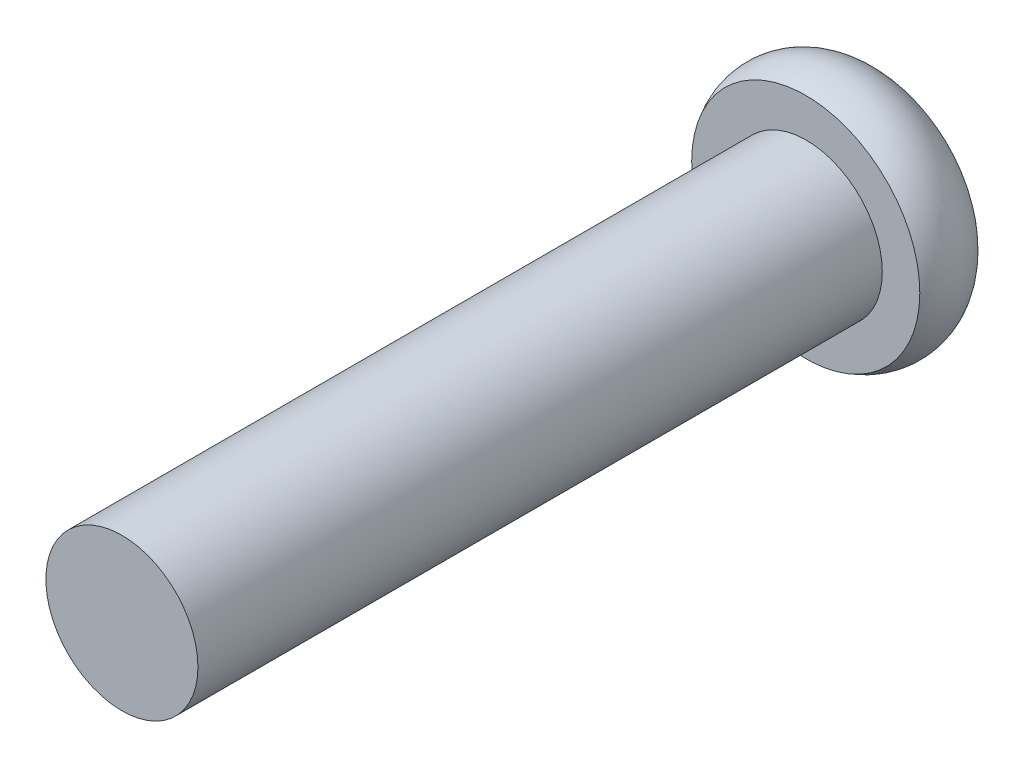
ISO-10303-21;
HEADER;
FILE_DESCRIPTION(('STEP AP214'),'2;1');
FILE_NAME('part.step','',(''),(''),'','','');
FILE_SCHEMA(('AUTOMOTIVE_DESIGN { 1 0 10303 214 1 1 1 1 }'));
ENDSEC;
DATA;
#1=APPLICATION_CONTEXT('core data for automotive mechanical design processes');
#2=APPLICATION_PROTOCOL_DEFINITION('international standard','automotive_design',2000,#1);
#3=PRODUCT_CONTEXT('',#1,'mechanical');
#4=PRODUCT('Part','Part','',(#3));
#5=PRODUCT_RELATED_PRODUCT_CATEGORY('part','',(#4));
#6=PRODUCT_DEFINITION_FORMATION('','',#4);
#7=PRODUCT_DEFINITION_CONTEXT('part definition',#1,'design');
#8=PRODUCT_DEFINITION('design','',#6,#7);
#9=PRODUCT_DEFINITION_SHAPE('','',#8);
#10=(LENGTH_UNIT() NAMED_UNIT(*) SI_UNIT(.MILLI.,.METRE.));
#11=(NAMED_UNIT(*) PLANE_ANGLE_UNIT() SI_UNIT($,.RADIAN.));
#12=(NAMED_UNIT(*) SI_UNIT($,.STERADIAN.) SOLID_ANGLE_UNIT());
#13=UNCERTAINTY_MEASURE_WITH_UNIT(LENGTH_MEASURE(1.E-05),#10,'distance_accuracy_value','');
#14=(GEOMETRIC_REPRESENTATION_CONTEXT(3) GLOBAL_UNCERTAINTY_ASSIGNED_CONTEXT((#13)) GLOBAL_UNIT_ASSIGNED_CONTEXT((#10,
#11,#12)) REPRESENTATION_CONTEXT('',''));
#15=CARTESIAN_POINT('',(0.,0.,0.));
#16=DIRECTION('',(0.,0.,1.));
#17=DIRECTION('',(1.,0.,0.));
#18=AXIS2_PLACEMENT_3D('',#15,#16,#17);
#19=CARTESIAN_POINT('',(0.,0.,0.));
#20=DIRECTION('',(0.,0.,1.));
#21=DIRECTION('',(1.,0.,0.));
#22=AXIS2_PLACEMENT_3D('',#19,#20,#21);
#23=PLANE('',#22);
#24=CARTESIAN_POINT('',(0.,0.,0.));
#25=DIRECTION('',(0.,0.,1.));
#26=DIRECTION('',(1.,0.,0.));
#27=AXIS2_PLACEMENT_3D('',#24,#25,#26);
#28=CIRCLE('',#27,3.);
#29=CARTESIAN_POINT('',(3.,0.,0.));
#30=VERTEX_POINT('',#29);
#31=EDGE_CURVE('E156',#30,#30,#28,.T.);
#32=ORIENTED_EDGE('',*,*,#31,.T.);
#33=EDGE_LOOP('',(#32));
#34=FACE_BOUND('',#33,.T.);
#35=CARTESIAN_POINT('',(0.0135896024399493,-0.0135896024399496,0.));
#36=DIRECTION('',(0.,0.,1.));
#37=DIRECTION('',(1.,0.,0.));
#38=AXIS2_PLACEMENT_3D('',#35,#36,#37);
#39=CIRCLE('',#38,2.);
#40=CARTESIAN_POINT('',(2.01358960243995,-0.0135896024399496,0.));
#41=VERTEX_POINT('',#40);
#42=EDGE_CURVE('E184',#41,#41,#39,.T.);
#43=ORIENTED_EDGE('',*,*,#42,.F.);
#44=EDGE_LOOP('',(#43));
#45=FACE_BOUND('',#44,.T.);
#46=ADVANCED_FACE('F35',(#34,#45),#23,.T.);
#47=CARTESIAN_POINT('',(0.,0.,-2.));
#48=DIRECTION('',(0.,0.,-1.));
#49=DIRECTION('',(-1.,0.,0.));
#50=AXIS2_PLACEMENT_3D('',#47,#48,#49);
#51=PLANE('',#50);
#52=DIRECTION('',(0.,1.,0.));
#53=VECTOR('',#52,1.);
#54=CARTESIAN_POINT('',(-0.5,-0.5,-2.));
#55=LINE('',#54,#53);
#56=CARTESIAN_POINT('',(-0.5,-2.,-2.));
#57=VERTEX_POINT('',#56);
#58=CARTESIAN_POINT('',(-0.5,-0.5,-2.));
#59=VERTEX_POINT('',#58);
#60=EDGE_CURVE('E49',#57,#59,#55,.T.);
#61=ORIENTED_EDGE('',*,*,#60,.F.);
#62=DIRECTION('',(-1.,0.,0.));
#63=VECTOR('',#62,1.);
#64=CARTESIAN_POINT('',(0.5,-2.,-2.));
#65=LINE('',#64,#63);
#66=CARTESIAN_POINT('',(0.5,-2.,-2.));
#67=VERTEX_POINT('',#66);
#68=EDGE_CURVE('E152',#67,#57,#65,.T.);
#69=ORIENTED_EDGE('',*,*,#68,.F.);
#70=DIRECTION('',(0.,-1.,0.));
#71=VECTOR('',#70,1.);
#72=CARTESIAN_POINT('',(0.5,-0.5,-2.));
#73=LINE('',#72,#71);
#74=CARTESIAN_POINT('',(0.5,-0.5,-2.));
#75=VERTEX_POINT('',#74);
#76=EDGE_CURVE('E216',#75,#67,#73,.T.);
#77=ORIENTED_EDGE('',*,*,#76,.F.);
#78=DIRECTION('',(-1.,0.,0.));
#79=VECTOR('',#78,1.);
#80=CARTESIAN_POINT('',(2.,-0.5,-2.));
#81=LINE('',#80,#79);
#82=CARTESIAN_POINT('',(2.,-0.5,-2.));
#83=VERTEX_POINT('',#82);
#84=EDGE_CURVE('E213',#83,#75,#81,.T.);
#85=ORIENTED_EDGE('',*,*,#84,.F.);
#86=DIRECTION('',(0.,-1.,0.));
#87=VECTOR('',#86,1.);
#88=CARTESIAN_POINT('',(2.,0.5,-2.));
#89=LINE('',#88,#87);
#90=CARTESIAN_POINT('',(2.,0.5,-2.));
#91=VERTEX_POINT('',#90);
#92=EDGE_CURVE('E210',#91,#83,#89,.T.);
#93=ORIENTED_EDGE('',*,*,#92,.F.);
#94=DIRECTION('',(1.,0.,0.));
#95=VECTOR('',#94,1.);
#96=CARTESIAN_POINT('',(2.,0.5,-2.));
#97=LINE('',#96,#95);
#98=CARTESIAN_POINT('',(0.5,0.5,-2.));
#99=VERTEX_POINT('',#98);
#100=EDGE_CURVE('E207',#99,#91,#97,.T.);
#101=ORIENTED_EDGE('',*,*,#100,.F.);
#102=DIRECTION('',(0.,-1.,0.));
#103=VECTOR('',#102,1.);
#104=CARTESIAN_POINT('',(0.5,2.,-2.));
#105=LINE('',#104,#103);
#106=CARTESIAN_POINT('',(0.5,2.,-2.));
#107=VERTEX_POINT('',#106);
#108=EDGE_CURVE('E204',#107,#99,#105,.T.);
#109=ORIENTED_EDGE('',*,*,#108,.F.);
#110=DIRECTION('',(1.,0.,0.));
#111=VECTOR('',#110,1.);
#112=CARTESIAN_POINT('',(0.5,2.,-2.));
#113=LINE('',#112,#111);
#114=CARTESIAN_POINT('',(-0.5,2.,-2.));
#115=VERTEX_POINT('',#114);
#116=EDGE_CURVE('E201',#115,#107,#113,.T.);
#117=ORIENTED_EDGE('',*,*,#116,.F.);
#118=DIRECTION('',(0.,1.,0.));
#119=VECTOR('',#118,1.);
#120=CARTESIAN_POINT('',(-0.5,2.,-2.));
#121=LINE('',#120,#119);
#122=CARTESIAN_POINT('',(-0.5,0.5,-2.));
#123=VERTEX_POINT('',#122);
#124=EDGE_CURVE('E198',#123,#115,#121,.T.);
#125=ORIENTED_EDGE('',*,*,#124,.F.);
#126=DIRECTION('',(1.,0.,0.));
#127=VECTOR('',#126,1.);
#128=CARTESIAN_POINT('',(-0.5,0.5,-2.));
#129=LINE('',#128,#127);
#130=CARTESIAN_POINT('',(-2.,0.5,-2.));
#131=VERTEX_POINT('',#130);
#132=EDGE_CURVE('E195',#131,#123,#129,.T.);
#133=ORIENTED_EDGE('',*,*,#132,.F.);
#134=DIRECTION('',(0.,1.,0.));
#135=VECTOR('',#134,1.);
#136=CARTESIAN_POINT('',(-2.,0.5,-2.));
#137=LINE('',#136,#135);
#138=CARTESIAN_POINT('',(-2.,-0.5,-2.));
#139=VERTEX_POINT('',#138);
#140=EDGE_CURVE('E193',#139,#131,#137,.T.);
#141=ORIENTED_EDGE('',*,*,#140,.F.);
#142=DIRECTION('',(-1.,0.,0.));
#143=VECTOR('',#142,1.);
#144=CARTESIAN_POINT('',(-0.5,-0.5,-2.));
#145=LINE('',#144,#143);
#146=EDGE_CURVE('E134',#59,#139,#145,.T.);
#147=ORIENTED_EDGE('',*,*,#146,.F.);
#148=EDGE_LOOP('',(#61,#69,#77,#85,#93,#101,#109,#117,#125,#133,#141,#147));
#149=FACE_BOUND('',#148,.T.);
#150=CARTESIAN_POINT('',(0.,0.,-2.));
#151=DIRECTION('',(0.,0.,1.));
#152=DIRECTION('',(1.,0.,0.));
#153=AXIS2_PLACEMENT_3D('',#150,#151,#152);
#154=CIRCLE('',#153,2.29828566126008);
#155=CARTESIAN_POINT('',(2.29828566126008,0.,-2.));
#156=VERTEX_POINT('',#155);
#157=EDGE_CURVE('E11',#156,#156,#154,.T.);
#158=ORIENTED_EDGE('',*,*,#157,.F.);
#159=EDGE_LOOP('',(#158));
#160=FACE_BOUND('',#159,.T.);
#161=ADVANCED_FACE('F166',(#149,#160),#51,.T.);
#162=CARTESIAN_POINT('',(0.,0.,-1.5));
#163=DIRECTION('',(0.,0.,1.));
#164=DIRECTION('',(1.,0.,0.));
#165=AXIS2_PLACEMENT_3D('',#162,#163,#164);
#166=TOROIDAL_SURFACE('',#165,2.29828566126008,0.5);
#167=ORIENTED_EDGE('',*,*,#157,.T.);
#168=EDGE_LOOP('',(#167));
#169=FACE_BOUND('',#168,.T.);
#170=CARTESIAN_POINT('',(0.,0.,-1.91742578561798));
#171=DIRECTION('',(0.,0.,1.));
#172=DIRECTION('',(1.,0.,0.));
#173=AXIS2_PLACEMENT_3D('',#170,#171,#172);
#174=CIRCLE('',#173,2.5735232195642);
#175=CARTESIAN_POINT('',(2.5735232195642,0.,-1.91742578561798));
#176=VERTEX_POINT('',#175);
#177=EDGE_CURVE('E42',#176,#176,#174,.T.);
#178=ORIENTED_EDGE('',*,*,#177,.F.);
#179=EDGE_LOOP('',(#178));
#180=FACE_BOUND('',#179,.T.);
#181=ADVANCED_FACE('F164',(#169,#180),#166,.T.);
#182=CARTESIAN_POINT('',(0.,0.,-0.738365689933416));
#183=DIRECTION('',(0.,0.,1.));
#184=DIRECTION('',(1.,0.,0.));
#185=AXIS2_PLACEMENT_3D('',#182,#183,#184);
#186=TOROIDAL_SURFACE('',#185,1.79608772561263,1.41229906765225);
#187=ORIENTED_EDGE('',*,*,#177,.T.);
#188=EDGE_LOOP('',(#187));
#189=FACE_BOUND('',#188,.T.);
#190=ORIENTED_EDGE('',*,*,#31,.F.);
#191=EDGE_LOOP('',(#190));
#192=FACE_BOUND('',#191,.T.);
#193=ADVANCED_FACE('F161',(#189,#192),#186,.T.);
#194=CARTESIAN_POINT('',(-0.5,-0.5,-2.));
#195=DIRECTION('',(-0.978147600733806,0.,0.20791169081776));
#196=DIRECTION('',(0.20791169081776,0.,0.978147600733806));
#197=AXIS2_PLACEMENT_3D('',#194,#195,#196);
#198=PLANE('',#197);
#199=ORIENTED_EDGE('',*,*,#60,.T.);
#200=DIRECTION('',(-0.203558594952779,-0.203558594952779,-0.957667894857973));
#201=VECTOR('',#200,1.);
#202=CARTESIAN_POINT('',(-0.5,-0.5,-2.));
#203=LINE('',#202,#201);
#204=CARTESIAN_POINT('',(-0.0748868766599549,-0.074886876659955,0.));
#205=VERTEX_POINT('',#204);
#206=EDGE_CURVE('E89',#205,#59,#203,.T.);
#207=ORIENTED_EDGE('',*,*,#206,.F.);
#208=DIRECTION('',(0.,1.,0.));
#209=VECTOR('',#208,1.);
#210=CARTESIAN_POINT('',(-0.0748868766599548,0.,0.));
#211=LINE('',#210,#209);
#212=CARTESIAN_POINT('',(-0.0748868766599552,-1.57488687665996,0.));
#213=VERTEX_POINT('',#212);
#214=EDGE_CURVE('E150',#213,#205,#211,.T.);
#215=ORIENTED_EDGE('',*,*,#214,.F.);
#216=DIRECTION('',(-0.203558594952779,-0.203558594952779,-0.957667894857973));
#217=VECTOR('',#216,1.);
#218=CARTESIAN_POINT('',(-0.45856389842085,-1.95856389842085,-1.80505846889133));
#219=LINE('',#218,#217);
#220=EDGE_CURVE('E57',#213,#57,#219,.T.);
#221=ORIENTED_EDGE('',*,*,#220,.T.);
#222=EDGE_LOOP('',(#199,#207,#215,#221));
#223=FACE_BOUND('',#222,.T.);
#224=ADVANCED_FACE('F173',(#223),#198,.F.);
#225=CARTESIAN_POINT('',(0.5,-2.,-2.));
#226=DIRECTION('',(0.,-0.978147600733806,0.20791169081776));
#227=DIRECTION('',(0.,-0.20791169081776,-0.978147600733806));
#228=AXIS2_PLACEMENT_3D('',#225,#226,#227);
#229=PLANE('',#228);
#230=ORIENTED_EDGE('',*,*,#68,.T.);
#231=ORIENTED_EDGE('',*,*,#220,.F.);
#232=DIRECTION('',(-1.,0.,0.));
#233=VECTOR('',#232,1.);
#234=CARTESIAN_POINT('',(0.,-1.57488687665995,0.));
#235=LINE('',#234,#233);
#236=CARTESIAN_POINT('',(0.0748868766599548,-1.57488687665996,0.));
#237=VERTEX_POINT('',#236);
#238=EDGE_CURVE('E220',#237,#213,#235,.T.);
#239=ORIENTED_EDGE('',*,*,#238,.F.);
#240=DIRECTION('',(0.203558594952779,-0.203558594952779,-0.957667894857973));
#241=VECTOR('',#240,1.);
#242=CARTESIAN_POINT('',(0.437845847631275,-1.93784584763128,-1.70758770333699));
#243=LINE('',#242,#241);
#244=EDGE_CURVE('E94',#237,#67,#243,.T.);
#245=ORIENTED_EDGE('',*,*,#244,.T.);
#246=EDGE_LOOP('',(#230,#231,#239,#245));
#247=FACE_BOUND('',#246,.T.);
#248=ADVANCED_FACE('F291',(#247),#229,.F.);
#249=CARTESIAN_POINT('',(0.5,-0.5,-2.));
#250=DIRECTION('',(0.978147600733806,0.,0.20791169081776));
#251=DIRECTION('',(0.20791169081776,0.,-0.978147600733806));
#252=AXIS2_PLACEMENT_3D('',#249,#250,#251);
#253=PLANE('',#252);
#254=ORIENTED_EDGE('',*,*,#76,.T.);
#255=ORIENTED_EDGE('',*,*,#244,.F.);
#256=DIRECTION('',(0.,-1.,0.));
#257=VECTOR('',#256,1.);
#258=CARTESIAN_POINT('',(0.0748868766599551,0.,0.));
#259=LINE('',#258,#257);
#260=CARTESIAN_POINT('',(0.0748868766599551,-0.074886876659955,0.));
#261=VERTEX_POINT('',#260);
#262=EDGE_CURVE('E239',#261,#237,#259,.T.);
#263=ORIENTED_EDGE('',*,*,#262,.F.);
#264=DIRECTION('',(0.203558594952779,-0.203558594952779,-0.957667894857973));
#265=VECTOR('',#264,1.);
#266=CARTESIAN_POINT('',(0.5,-0.5,-2.));
#267=LINE('',#266,#265);
#268=EDGE_CURVE('E235',#261,#75,#267,.T.);
#269=ORIENTED_EDGE('',*,*,#268,.T.);
#270=EDGE_LOOP('',(#254,#255,#263,#269));
#271=FACE_BOUND('',#270,.T.);
#272=ADVANCED_FACE('F289',(#271),#253,.F.);
#273=CARTESIAN_POINT('',(2.,-0.5,-2.));
#274=DIRECTION('',(0.,-0.978147600733806,0.20791169081776));
#275=DIRECTION('',(0.,-0.20791169081776,-0.978147600733806));
#276=AXIS2_PLACEMENT_3D('',#273,#274,#275);
#277=PLANE('',#276);
#278=ORIENTED_EDGE('',*,*,#84,.T.);
#279=ORIENTED_EDGE('',*,*,#268,.F.);
#280=DIRECTION('',(-1.,0.,0.));
#281=VECTOR('',#280,1.);
#282=CARTESIAN_POINT('',(0.,-0.0748868766599549,0.));
#283=LINE('',#282,#281);
#284=CARTESIAN_POINT('',(1.57488687665996,-0.074886876659955,0.));
#285=VERTEX_POINT('',#284);
#286=EDGE_CURVE('E242',#285,#261,#283,.T.);
#287=ORIENTED_EDGE('',*,*,#286,.F.);
#288=DIRECTION('',(0.203558594952779,-0.203558594952779,-0.957667894857973));
#289=VECTOR('',#288,1.);
#290=CARTESIAN_POINT('',(1.95856389842085,-0.45856389842085,-1.80505846889133));
#291=LINE('',#290,#289);
#292=EDGE_CURVE('E233',#285,#83,#291,.T.);
#293=ORIENTED_EDGE('',*,*,#292,.T.);
#294=EDGE_LOOP('',(#278,#279,#287,#293));
#295=FACE_BOUND('',#294,.T.);
#296=ADVANCED_FACE('F285',(#295),#277,.F.);
#297=CARTESIAN_POINT('',(2.,0.5,-2.));
#298=DIRECTION('',(0.978147600733806,0.,0.20791169081776));
#299=DIRECTION('',(0.20791169081776,0.,-0.978147600733806));
#300=AXIS2_PLACEMENT_3D('',#297,#298,#299);
#301=PLANE('',#300);
#302=ORIENTED_EDGE('',*,*,#92,.T.);
#303=ORIENTED_EDGE('',*,*,#292,.F.);
#304=DIRECTION('',(0.,-1.,0.));
#305=VECTOR('',#304,1.);
#306=CARTESIAN_POINT('',(1.57488687665995,0.,0.));
#307=LINE('',#306,#305);
#308=CARTESIAN_POINT('',(1.57488687665996,0.0748868766599549,0.));
#309=VERTEX_POINT('',#308);
#310=EDGE_CURVE('E245',#309,#285,#307,.T.);
#311=ORIENTED_EDGE('',*,*,#310,.F.);
#312=DIRECTION('',(0.203558594952779,0.203558594952779,-0.957667894857973));
#313=VECTOR('',#312,1.);
#314=CARTESIAN_POINT('',(2.,0.5,-2.));
#315=LINE('',#314,#313);
#316=EDGE_CURVE('E231',#309,#91,#315,.T.);
#317=ORIENTED_EDGE('',*,*,#316,.T.);
#318=EDGE_LOOP('',(#302,#303,#311,#317));
#319=FACE_BOUND('',#318,.T.);
#320=ADVANCED_FACE('F281',(#319),#301,.F.);
#321=CARTESIAN_POINT('',(2.,0.5,-2.));
#322=DIRECTION('',(0.,0.978147600733805,0.20791169081776));
#323=DIRECTION('',(0.,-0.20791169081776,0.978147600733806));
#324=AXIS2_PLACEMENT_3D('',#321,#322,#323);
#325=PLANE('',#324);
#326=ORIENTED_EDGE('',*,*,#100,.T.);
#327=ORIENTED_EDGE('',*,*,#316,.F.);
#328=DIRECTION('',(1.,0.,0.));
#329=VECTOR('',#328,1.);
#330=CARTESIAN_POINT('',(0.,0.074886876659955,0.));
#331=LINE('',#330,#329);
#332=CARTESIAN_POINT('',(0.0748868766599547,0.0748868766599549,0.));
#333=VERTEX_POINT('',#332);
#334=EDGE_CURVE('E248',#333,#309,#331,.T.);
#335=ORIENTED_EDGE('',*,*,#334,.F.);
#336=DIRECTION('',(0.203558594952779,0.203558594952779,-0.957667894857973));
#337=VECTOR('',#336,1.);
#338=CARTESIAN_POINT('',(0.562154152368724,0.562154152368725,-2.29241229666301));
#339=LINE('',#338,#337);
#340=EDGE_CURVE('E229',#333,#99,#339,.T.);
#341=ORIENTED_EDGE('',*,*,#340,.T.);
#342=EDGE_LOOP('',(#326,#327,#335,#341));
#343=FACE_BOUND('',#342,.T.);
#344=ADVANCED_FACE('F277',(#343),#325,.F.);
#345=CARTESIAN_POINT('',(0.5,2.,-2.));
#346=DIRECTION('',(0.978147600733806,0.,0.20791169081776));
#347=DIRECTION('',(0.20791169081776,0.,-0.978147600733806));
#348=AXIS2_PLACEMENT_3D('',#345,#346,#347);
#349=PLANE('',#348);
#350=ORIENTED_EDGE('',*,*,#108,.T.);
#351=ORIENTED_EDGE('',*,*,#340,.F.);
#352=DIRECTION('',(0.,-1.,0.));
#353=VECTOR('',#352,1.);
#354=CARTESIAN_POINT('',(0.0748868766599546,0.,0.));
#355=LINE('',#354,#353);
#356=CARTESIAN_POINT('',(0.0748868766599549,1.57488687665996,0.));
#357=VERTEX_POINT('',#356);
#358=EDGE_CURVE('E251',#357,#333,#355,.T.);
#359=ORIENTED_EDGE('',*,*,#358,.F.);
#360=DIRECTION('',(0.203558594952779,0.203558594952779,-0.957667894857973));
#361=VECTOR('',#360,1.);
#362=CARTESIAN_POINT('',(0.5,2.,-2.));
#363=LINE('',#362,#361);
#364=EDGE_CURVE('E227',#357,#107,#363,.T.);
#365=ORIENTED_EDGE('',*,*,#364,.T.);
#366=EDGE_LOOP('',(#350,#351,#359,#365));
#367=FACE_BOUND('',#366,.T.);
#368=ADVANCED_FACE('F273',(#367),#349,.F.);
#369=CARTESIAN_POINT('',(0.5,2.,-2.));
#370=DIRECTION('',(0.,0.978147600733806,0.20791169081776));
#371=DIRECTION('',(0.,-0.20791169081776,0.978147600733806));
#372=AXIS2_PLACEMENT_3D('',#369,#370,#371);
#373=PLANE('',#372);
#374=ORIENTED_EDGE('',*,*,#116,.T.);
#375=ORIENTED_EDGE('',*,*,#364,.F.);
#376=DIRECTION('',(1.,0.,0.));
#377=VECTOR('',#376,1.);
#378=CARTESIAN_POINT('',(0.,1.57488687665995,0.));
#379=LINE('',#378,#377);
#380=CARTESIAN_POINT('',(-0.0748868766599548,1.57488687665996,0.));
#381=VERTEX_POINT('',#380);
#382=EDGE_CURVE('E254',#381,#357,#379,.T.);
#383=ORIENTED_EDGE('',*,*,#382,.F.);
#384=DIRECTION('',(-0.203558594952779,0.203558594952779,-0.957667894857973));
#385=VECTOR('',#384,1.);
#386=CARTESIAN_POINT('',(-0.5,2.,-2.));
#387=LINE('',#386,#385);
#388=EDGE_CURVE('E225',#381,#115,#387,.T.);
#389=ORIENTED_EDGE('',*,*,#388,.T.);
#390=EDGE_LOOP('',(#374,#375,#383,#389));
#391=FACE_BOUND('',#390,.T.);
#392=ADVANCED_FACE('F269',(#391),#373,.F.);
#393=CARTESIAN_POINT('',(-0.5,2.,-2.));
#394=DIRECTION('',(-0.978147600733806,0.,0.20791169081776));
#395=DIRECTION('',(0.20791169081776,0.,0.978147600733806));
#396=AXIS2_PLACEMENT_3D('',#393,#394,#395);
#397=PLANE('',#396);
#398=ORIENTED_EDGE('',*,*,#124,.T.);
#399=ORIENTED_EDGE('',*,*,#388,.F.);
#400=DIRECTION('',(0.,1.,0.));
#401=VECTOR('',#400,1.);
#402=CARTESIAN_POINT('',(-0.0748868766599548,0.,0.));
#403=LINE('',#402,#401);
#404=CARTESIAN_POINT('',(-0.0748868766599549,0.074886876659955,0.));
#405=VERTEX_POINT('',#404);
#406=EDGE_CURVE('E257',#405,#381,#403,.T.);
#407=ORIENTED_EDGE('',*,*,#406,.F.);
#408=DIRECTION('',(-0.203558594952779,0.203558594952779,-0.957667894857973));
#409=VECTOR('',#408,1.);
#410=CARTESIAN_POINT('',(-0.562154152368724,0.562154152368725,-2.29241229666301));
#411=LINE('',#410,#409);
#412=EDGE_CURVE('E223',#405,#123,#411,.T.);
#413=ORIENTED_EDGE('',*,*,#412,.T.);
#414=EDGE_LOOP('',(#398,#399,#407,#413));
#415=FACE_BOUND('',#414,.T.);
#416=ADVANCED_FACE('F265',(#415),#397,.F.);
#417=CARTESIAN_POINT('',(-0.5,0.5,-2.));
#418=DIRECTION('',(0.,0.978147600733806,0.20791169081776));
#419=DIRECTION('',(0.,-0.20791169081776,0.978147600733806));
#420=AXIS2_PLACEMENT_3D('',#417,#418,#419);
#421=PLANE('',#420);
#422=ORIENTED_EDGE('',*,*,#132,.T.);
#423=ORIENTED_EDGE('',*,*,#412,.F.);
#424=DIRECTION('',(1.,0.,0.));
#425=VECTOR('',#424,1.);
#426=CARTESIAN_POINT('',(0.,0.0748868766599549,0.));
#427=LINE('',#426,#425);
#428=CARTESIAN_POINT('',(-1.57488687665996,0.074886876659955,0.));
#429=VERTEX_POINT('',#428);
#430=EDGE_CURVE('E146',#429,#405,#427,.T.);
#431=ORIENTED_EDGE('',*,*,#430,.F.);
#432=DIRECTION('',(-0.203558594952779,0.203558594952779,-0.957667894857973));
#433=VECTOR('',#432,1.);
#434=CARTESIAN_POINT('',(-2.,0.5,-2.));
#435=LINE('',#434,#433);
#436=EDGE_CURVE('E138',#429,#131,#435,.T.);
#437=ORIENTED_EDGE('',*,*,#436,.T.);
#438=EDGE_LOOP('',(#422,#423,#431,#437));
#439=FACE_BOUND('',#438,.T.);
#440=ADVANCED_FACE('F261',(#439),#421,.F.);
#441=CARTESIAN_POINT('',(-2.,0.5,-2.));
#442=DIRECTION('',(-0.978147600733806,0.,0.20791169081776));
#443=DIRECTION('',(0.20791169081776,0.,0.978147600733806));
#444=AXIS2_PLACEMENT_3D('',#441,#442,#443);
#445=PLANE('',#444);
#446=ORIENTED_EDGE('',*,*,#140,.T.);
#447=ORIENTED_EDGE('',*,*,#436,.F.);
#448=DIRECTION('',(0.,1.,0.));
#449=VECTOR('',#448,1.);
#450=CARTESIAN_POINT('',(-1.57488687665995,0.,0.));
#451=LINE('',#450,#449);
#452=CARTESIAN_POINT('',(-1.57488687665995,-0.074886876659955,0.));
#453=VERTEX_POINT('',#452);
#454=EDGE_CURVE('E141',#453,#429,#451,.T.);
#455=ORIENTED_EDGE('',*,*,#454,.F.);
#456=DIRECTION('',(-0.203558594952779,-0.203558594952779,-0.957667894857973));
#457=VECTOR('',#456,1.);
#458=CARTESIAN_POINT('',(-1.93784584763128,-0.437845847631276,-1.70758770333699));
#459=LINE('',#458,#457);
#460=EDGE_CURVE('E127',#453,#139,#459,.T.);
#461=ORIENTED_EDGE('',*,*,#460,.T.);
#462=EDGE_LOOP('',(#446,#447,#455,#461));
#463=FACE_BOUND('',#462,.T.);
#464=ADVANCED_FACE('F142',(#463),#445,.F.);
#465=CARTESIAN_POINT('',(-0.5,-0.5,-2.));
#466=DIRECTION('',(0.,-0.978147600733806,0.20791169081776));
#467=DIRECTION('',(0.,-0.20791169081776,-0.978147600733806));
#468=AXIS2_PLACEMENT_3D('',#465,#466,#467);
#469=PLANE('',#468);
#470=ORIENTED_EDGE('',*,*,#146,.T.);
#471=ORIENTED_EDGE('',*,*,#460,.F.);
#472=DIRECTION('',(-1.,0.,0.));
#473=VECTOR('',#472,1.);
#474=CARTESIAN_POINT('',(0.,-0.0748868766599549,0.));
#475=LINE('',#474,#473);
#476=EDGE_CURVE('E131',#205,#453,#475,.T.);
#477=ORIENTED_EDGE('',*,*,#476,.F.);
#478=ORIENTED_EDGE('',*,*,#206,.T.);
#479=EDGE_LOOP('',(#470,#471,#477,#478));
#480=FACE_BOUND('',#479,.T.);
#481=ADVANCED_FACE('F129',(#480),#469,.F.);
#482=CARTESIAN_POINT('',(0.0135896024399493,-0.0135896024399496,0.));
#483=DIRECTION('',(0.,0.,1.));
#484=DIRECTION('',(1.,0.,0.));
#485=AXIS2_PLACEMENT_3D('',#482,#483,#484);
#486=PLANE('',#485);
#487=ORIENTED_EDGE('',*,*,#238,.T.);
#488=ORIENTED_EDGE('',*,*,#214,.T.);
#489=ORIENTED_EDGE('',*,*,#476,.T.);
#490=ORIENTED_EDGE('',*,*,#454,.T.);
#491=ORIENTED_EDGE('',*,*,#430,.T.);
#492=ORIENTED_EDGE('',*,*,#406,.T.);
#493=ORIENTED_EDGE('',*,*,#382,.T.);
#494=ORIENTED_EDGE('',*,*,#358,.T.);
#495=ORIENTED_EDGE('',*,*,#334,.T.);
#496=ORIENTED_EDGE('',*,*,#310,.T.);
#497=ORIENTED_EDGE('',*,*,#286,.T.);
#498=ORIENTED_EDGE('',*,*,#262,.T.);
#499=EDGE_LOOP('',(#487,#488,#489,#490,#491,#492,#493,#494,#495,#496,#497,#498));
#500=FACE_BOUND('',#499,.T.);
#501=ADVANCED_FACE('F149',(#500),#486,.F.);
#502=CARTESIAN_POINT('',(0.0135896024399493,-0.0135896024399496,18.));
#503=DIRECTION('',(0.,0.,-1.));
#504=DIRECTION('',(-1.,0.,0.));
#505=AXIS2_PLACEMENT_3D('',#502,#503,#504);
#506=CYLINDRICAL_SURFACE('',#505,2.);
#507=CARTESIAN_POINT('',(0.0135896024399493,-0.0135896024399496,18.));
#508=DIRECTION('',(0.,0.,1.));
#509=DIRECTION('',(1.,0.,0.));
#510=AXIS2_PLACEMENT_3D('',#507,#508,#509);
#511=CIRCLE('',#510,2.);
#512=CARTESIAN_POINT('',(2.01358960243995,-0.0135896024399496,18.));
#513=VERTEX_POINT('',#512);
#514=EDGE_CURVE('E186',#513,#513,#511,.T.);
#515=ORIENTED_EDGE('',*,*,#514,.F.);
#516=EDGE_LOOP('',(#515));
#517=FACE_BOUND('',#516,.T.);
#518=ORIENTED_EDGE('',*,*,#42,.T.);
#519=EDGE_LOOP('',(#518));
#520=FACE_BOUND('',#519,.T.);
#521=ADVANCED_FACE('F319',(#517,#520),#506,.T.);
#522=CARTESIAN_POINT('',(0.0135896024399493,-0.0135896024399496,18.));
#523=DIRECTION('',(0.,0.,1.));
#524=DIRECTION('',(1.,0.,0.));
#525=AXIS2_PLACEMENT_3D('',#522,#523,#524);
#526=PLANE('',#525);
#527=ORIENTED_EDGE('',*,*,#514,.T.);
#528=EDGE_LOOP('',(#527));
#529=FACE_BOUND('',#528,.T.);
#530=ADVANCED_FACE('F322',(#529),#526,.T.);
#531=CLOSED_SHELL('',(#46,#161,#181,#193,#224,#248,#272,#296,#320,#344,#368,#392,#416,#440,#464,
#481,#501,#521,#530));
#532=MANIFOLD_SOLID_BREP('B2',#531);
#533=ADVANCED_BREP_SHAPE_REPRESENTATION('',(#18,#532),#14);
#534=SHAPE_DEFINITION_REPRESENTATION(#9,#533);
ENDSEC;
END-ISO-10303-21;
